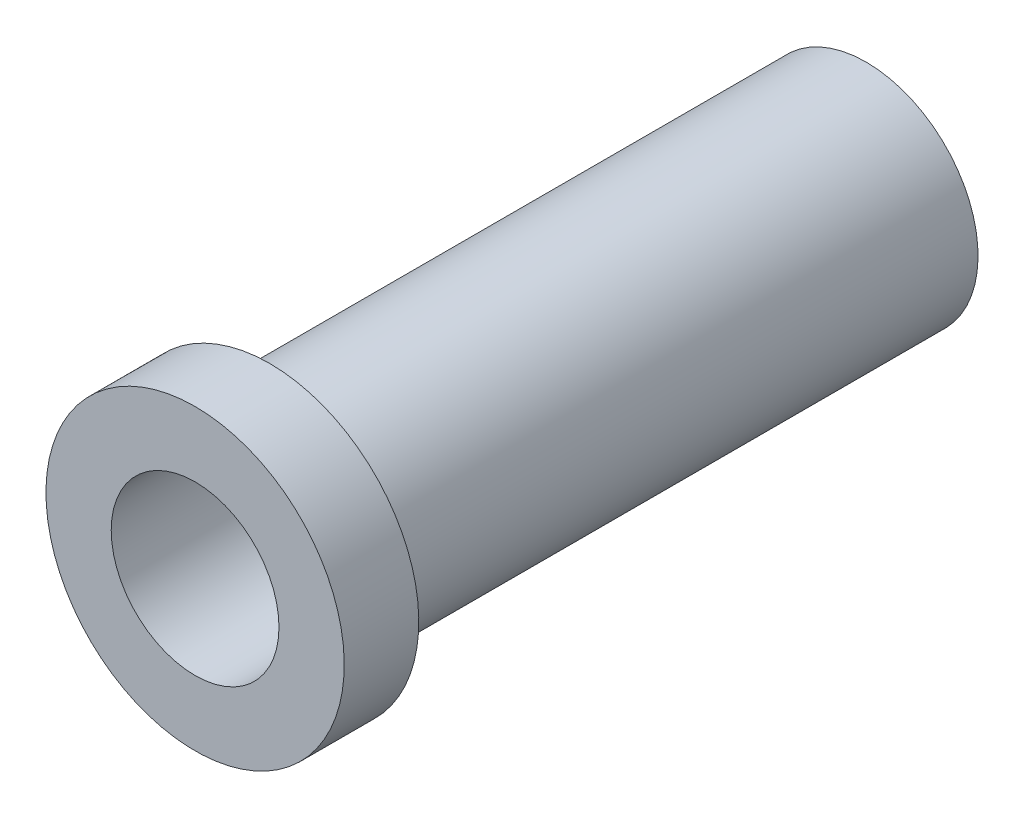
ISO-10303-21;
HEADER;
FILE_DESCRIPTION(('STEP AP214'),'2;1');
FILE_NAME('part.step','',(''),(''),'','','');
FILE_SCHEMA(('AUTOMOTIVE_DESIGN { 1 0 10303 214 1 1 1 1 }'));
ENDSEC;
DATA;
#1=APPLICATION_CONTEXT('core data for automotive mechanical design processes');
#2=APPLICATION_PROTOCOL_DEFINITION('international standard','automotive_design',2000,#1);
#3=PRODUCT_CONTEXT('',#1,'mechanical');
#4=PRODUCT('Part','Part','',(#3));
#5=PRODUCT_RELATED_PRODUCT_CATEGORY('part','',(#4));
#6=PRODUCT_DEFINITION_FORMATION('','',#4);
#7=PRODUCT_DEFINITION_CONTEXT('part definition',#1,'design');
#8=PRODUCT_DEFINITION('design','',#6,#7);
#9=PRODUCT_DEFINITION_SHAPE('','',#8);
#10=(LENGTH_UNIT() NAMED_UNIT(*) SI_UNIT(.MILLI.,.METRE.));
#11=(NAMED_UNIT(*) PLANE_ANGLE_UNIT() SI_UNIT($,.RADIAN.));
#12=(NAMED_UNIT(*) SI_UNIT($,.STERADIAN.) SOLID_ANGLE_UNIT());
#13=UNCERTAINTY_MEASURE_WITH_UNIT(LENGTH_MEASURE(1.E-05),#10,'distance_accuracy_value','');
#14=(GEOMETRIC_REPRESENTATION_CONTEXT(3) GLOBAL_UNCERTAINTY_ASSIGNED_CONTEXT((#13)) GLOBAL_UNIT_ASSIGNED_CONTEXT((#10,
#11,#12)) REPRESENTATION_CONTEXT('',''));
#15=CARTESIAN_POINT('',(0.,0.,0.));
#16=DIRECTION('',(0.,0.,1.));
#17=DIRECTION('',(1.,0.,0.));
#18=AXIS2_PLACEMENT_3D('',#15,#16,#17);
#19=CARTESIAN_POINT('',(0.,-19.05,-57.15));
#20=DIRECTION('',(0.,0.,1.));
#21=DIRECTION('',(0.,-1.,0.));
#22=AXIS2_PLACEMENT_3D('',#19,#20,#21);
#23=PLANE('',#22);
#24=CARTESIAN_POINT('',(0.,0.,-57.15));
#25=DIRECTION('',(0.,0.,1.));
#26=DIRECTION('',(0.,-1.,0.));
#27=AXIS2_PLACEMENT_3D('',#24,#25,#26);
#28=CIRCLE('',#27,14.2875);
#29=CARTESIAN_POINT('',(0.,-14.2875,-57.15));
#30=VERTEX_POINT('',#29);
#31=EDGE_CURVE('E50',#30,#30,#28,.T.);
#32=ORIENTED_EDGE('',*,*,#31,.T.);
#33=EDGE_LOOP('',(#32));
#34=FACE_BOUND('',#33,.T.);
#35=CARTESIAN_POINT('',(0.,0.,-57.15));
#36=DIRECTION('',(0.,0.,-1.));
#37=DIRECTION('',(0.,1.,0.));
#38=AXIS2_PLACEMENT_3D('',#35,#36,#37);
#39=CIRCLE('',#38,19.05);
#40=CARTESIAN_POINT('',(0.,19.0500000000001,-57.15));
#41=VERTEX_POINT('',#40);
#42=EDGE_CURVE('E45',#41,#41,#39,.T.);
#43=ORIENTED_EDGE('',*,*,#42,.T.);
#44=EDGE_LOOP('',(#43));
#45=FACE_BOUND('',#44,.T.);
#46=ADVANCED_FACE('F31',(#34,#45),#23,.F.);
#47=CARTESIAN_POINT('',(0.,0.,57.15));
#48=DIRECTION('',(0.,0.,-1.));
#49=DIRECTION('',(0.,1.,0.));
#50=AXIS2_PLACEMENT_3D('',#47,#48,#49);
#51=PLANE('',#50);
#52=CARTESIAN_POINT('',(0.,0.,57.15));
#53=DIRECTION('',(0.,0.,1.));
#54=DIRECTION('',(1.,0.,0.));
#55=AXIS2_PLACEMENT_3D('',#52,#53,#54);
#56=CIRCLE('',#55,14.2875);
#57=CARTESIAN_POINT('',(14.2875,0.,57.15));
#58=VERTEX_POINT('',#57);
#59=EDGE_CURVE('E53',#58,#58,#56,.T.);
#60=ORIENTED_EDGE('',*,*,#59,.F.);
#61=EDGE_LOOP('',(#60));
#62=FACE_BOUND('',#61,.T.);
#63=CARTESIAN_POINT('',(0.,0.,57.15));
#64=DIRECTION('',(0.,0.,-1.));
#65=DIRECTION('',(0.,1.,0.));
#66=AXIS2_PLACEMENT_3D('',#63,#64,#65);
#67=CIRCLE('',#66,25.4);
#68=CARTESIAN_POINT('',(0.,25.4,57.15));
#69=VERTEX_POINT('',#68);
#70=EDGE_CURVE('E10',#69,#69,#67,.T.);
#71=ORIENTED_EDGE('',*,*,#70,.F.);
#72=EDGE_LOOP('',(#71));
#73=FACE_BOUND('',#72,.T.);
#74=ADVANCED_FACE('F60',(#62,#73),#51,.F.);
#75=CARTESIAN_POINT('',(0.,0.,-57.15));
#76=DIRECTION('',(0.,0.,-1.));
#77=DIRECTION('',(0.,1.,0.));
#78=AXIS2_PLACEMENT_3D('',#75,#76,#77);
#79=CYLINDRICAL_SURFACE('',#78,25.4);
#80=CARTESIAN_POINT('',(0.,0.,44.45));
#81=DIRECTION('',(0.,0.,-1.));
#82=DIRECTION('',(0.,1.,0.));
#83=AXIS2_PLACEMENT_3D('',#80,#81,#82);
#84=CIRCLE('',#83,25.4);
#85=CARTESIAN_POINT('',(0.,25.4,44.45));
#86=VERTEX_POINT('',#85);
#87=EDGE_CURVE('E37',#86,#86,#84,.T.);
#88=ORIENTED_EDGE('',*,*,#87,.F.);
#89=EDGE_LOOP('',(#88));
#90=FACE_BOUND('',#89,.T.);
#91=ORIENTED_EDGE('',*,*,#70,.T.);
#92=EDGE_LOOP('',(#91));
#93=FACE_BOUND('',#92,.T.);
#94=ADVANCED_FACE('F63',(#90,#93),#79,.T.);
#95=CARTESIAN_POINT('',(0.,-25.4,44.45));
#96=DIRECTION('',(0.,0.,1.));
#97=DIRECTION('',(0.,-1.,0.));
#98=AXIS2_PLACEMENT_3D('',#95,#96,#97);
#99=PLANE('',#98);
#100=CARTESIAN_POINT('',(0.,0.,44.45));
#101=DIRECTION('',(0.,0.,-1.));
#102=DIRECTION('',(0.,1.,0.));
#103=AXIS2_PLACEMENT_3D('',#100,#101,#102);
#104=CIRCLE('',#103,19.05);
#105=CARTESIAN_POINT('',(0.,19.05,44.45));
#106=VERTEX_POINT('',#105);
#107=EDGE_CURVE('E41',#106,#106,#104,.T.);
#108=ORIENTED_EDGE('',*,*,#107,.F.);
#109=EDGE_LOOP('',(#108));
#110=FACE_BOUND('',#109,.T.);
#111=ORIENTED_EDGE('',*,*,#87,.T.);
#112=EDGE_LOOP('',(#111));
#113=FACE_BOUND('',#112,.T.);
#114=ADVANCED_FACE('F68',(#110,#113),#99,.F.);
#115=CARTESIAN_POINT('',(0.,0.,-57.15));
#116=DIRECTION('',(0.,0.,-1.));
#117=DIRECTION('',(0.,1.,0.));
#118=AXIS2_PLACEMENT_3D('',#115,#116,#117);
#119=CYLINDRICAL_SURFACE('',#118,19.05);
#120=ORIENTED_EDGE('',*,*,#42,.F.);
#121=EDGE_LOOP('',(#120));
#122=FACE_BOUND('',#121,.T.);
#123=ORIENTED_EDGE('',*,*,#107,.T.);
#124=EDGE_LOOP('',(#123));
#125=FACE_BOUND('',#124,.T.);
#126=ADVANCED_FACE('F75',(#122,#125),#119,.T.);
#127=CARTESIAN_POINT('',(0.,0.,-69.85));
#128=DIRECTION('',(0.,0.,1.));
#129=DIRECTION('',(1.,0.,0.));
#130=AXIS2_PLACEMENT_3D('',#127,#128,#129);
#131=CYLINDRICAL_SURFACE('',#130,14.2875);
#132=ORIENTED_EDGE('',*,*,#59,.T.);
#133=EDGE_LOOP('',(#132));
#134=FACE_BOUND('',#133,.T.);
#135=ORIENTED_EDGE('',*,*,#31,.F.);
#136=EDGE_LOOP('',(#135));
#137=FACE_BOUND('',#136,.T.);
#138=ADVANCED_FACE('F57',(#134,#137),#131,.F.);
#139=CLOSED_SHELL('',(#46,#74,#94,#114,#126,#138));
#140=MANIFOLD_SOLID_BREP('B2',#139);
#141=ADVANCED_BREP_SHAPE_REPRESENTATION('',(#18,#140),#14);
#142=SHAPE_DEFINITION_REPRESENTATION(#9,#141);
ENDSEC;
END-ISO-10303-21;
